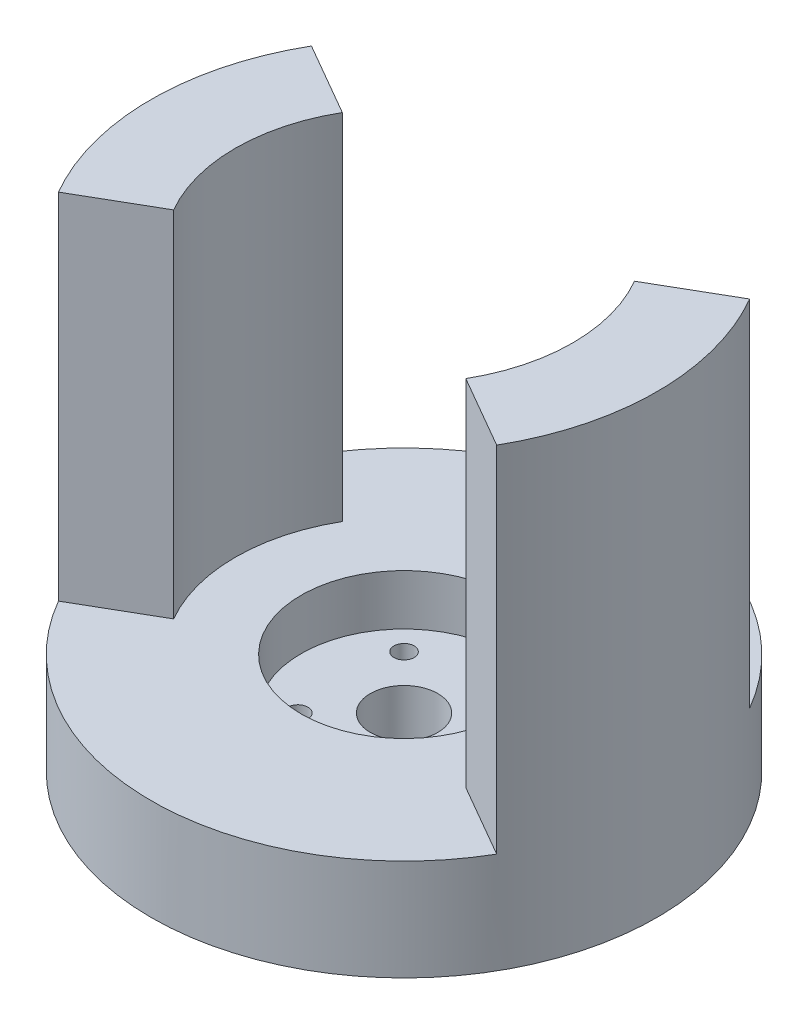
ISO-10303-21;
HEADER;
FILE_DESCRIPTION(('STEP AP214'),'2;1');
FILE_NAME('part.step','',(''),(''),'','','');
FILE_SCHEMA(('AUTOMOTIVE_DESIGN { 1 0 10303 214 1 1 1 1 }'));
ENDSEC;
DATA;
#1=APPLICATION_CONTEXT('core data for automotive mechanical design processes');
#2=APPLICATION_PROTOCOL_DEFINITION('international standard','automotive_design',2000,#1);
#3=PRODUCT_CONTEXT('',#1,'mechanical');
#4=PRODUCT('Part','Part','',(#3));
#5=PRODUCT_RELATED_PRODUCT_CATEGORY('part','',(#4));
#6=PRODUCT_DEFINITION_FORMATION('','',#4);
#7=PRODUCT_DEFINITION_CONTEXT('part definition',#1,'design');
#8=PRODUCT_DEFINITION('design','',#6,#7);
#9=PRODUCT_DEFINITION_SHAPE('','',#8);
#10=(LENGTH_UNIT() NAMED_UNIT(*) SI_UNIT(.MILLI.,.METRE.));
#11=(NAMED_UNIT(*) PLANE_ANGLE_UNIT() SI_UNIT($,.RADIAN.));
#12=(NAMED_UNIT(*) SI_UNIT($,.STERADIAN.) SOLID_ANGLE_UNIT());
#13=UNCERTAINTY_MEASURE_WITH_UNIT(LENGTH_MEASURE(1.E-05),#10,'distance_accuracy_value','');
#14=(GEOMETRIC_REPRESENTATION_CONTEXT(3) GLOBAL_UNCERTAINTY_ASSIGNED_CONTEXT((#13)) GLOBAL_UNIT_ASSIGNED_CONTEXT((#10,
#11,#12)) REPRESENTATION_CONTEXT('',''));
#15=CARTESIAN_POINT('',(0.,0.,0.));
#16=DIRECTION('',(0.,0.,1.));
#17=DIRECTION('',(1.,0.,0.));
#18=AXIS2_PLACEMENT_3D('',#15,#16,#17);
#19=CARTESIAN_POINT('',(0.,30.,0.));
#20=DIRECTION('',(0.,1.,0.));
#21=DIRECTION('',(0.,0.,1.));
#22=AXIS2_PLACEMENT_3D('',#19,#20,#21);
#23=PLANE('',#22);
#24=CARTESIAN_POINT('',(0.,30.,0.));
#25=DIRECTION('',(0.,1.,0.));
#26=DIRECTION('',(0.,0.,1.));
#27=AXIS2_PLACEMENT_3D('',#24,#25,#26);
#28=CIRCLE('',#27,30.5);
#29=CARTESIAN_POINT('',(0.,30.,30.5));
#30=VERTEX_POINT('',#29);
#31=EDGE_CURVE('E169',#30,#30,#28,.T.);
#32=ORIENTED_EDGE('',*,*,#31,.F.);
#33=EDGE_LOOP('',(#32));
#34=FACE_BOUND('',#33,.T.);
#35=CARTESIAN_POINT('',(0.,30.,0.));
#36=DIRECTION('',(0.,-1.,0.));
#37=DIRECTION('',(0.,0.,-1.));
#38=AXIS2_PLACEMENT_3D('',#35,#36,#37);
#39=CIRCLE('',#38,50.);
#40=CARTESIAN_POINT('',(43.301270189222,30.,-24.9999999999999));
#41=VERTEX_POINT('',#40);
#42=CARTESIAN_POINT('',(43.301270189222,30.,24.9999999999999));
#43=VERTEX_POINT('',#42);
#44=EDGE_CURVE('E283',#41,#43,#39,.T.);
#45=ORIENTED_EDGE('',*,*,#44,.F.);
#46=DIRECTION('',(-0.86602540378444,0.,0.499999999999998));
#47=VECTOR('',#46,1.);
#48=CARTESIAN_POINT('',(43.301270189222,30.,-24.9999999999999));
#49=LINE('',#48,#47);
#50=CARTESIAN_POINT('',(64.951905283833,30.,-37.4999999999999));
#51=VERTEX_POINT('',#50);
#52=EDGE_CURVE('E281',#51,#41,#49,.T.);
#53=ORIENTED_EDGE('',*,*,#52,.F.);
#54=CARTESIAN_POINT('',(0.,30.,0.));
#55=DIRECTION('',(0.,1.,0.));
#56=DIRECTION('',(0.,0.,1.));
#57=AXIS2_PLACEMENT_3D('',#54,#55,#56);
#58=CIRCLE('',#57,75.);
#59=CARTESIAN_POINT('',(-64.951905283833,30.,-37.4999999999998));
#60=VERTEX_POINT('',#59);
#61=EDGE_CURVE('E42',#51,#60,#58,.T.);
#62=ORIENTED_EDGE('',*,*,#61,.T.);
#63=DIRECTION('',(-0.86602540378444,0.,-0.499999999999998));
#64=VECTOR('',#63,1.);
#65=CARTESIAN_POINT('',(-43.301270189222,30.,-24.9999999999999));
#66=LINE('',#65,#64);
#67=CARTESIAN_POINT('',(-43.301270189222,30.,-24.9999999999999));
#68=VERTEX_POINT('',#67);
#69=EDGE_CURVE('E58',#68,#60,#66,.T.);
#70=ORIENTED_EDGE('',*,*,#69,.F.);
#71=CARTESIAN_POINT('',(0.,30.,0.));
#72=DIRECTION('',(0.,-1.,0.));
#73=DIRECTION('',(0.,0.,1.));
#74=AXIS2_PLACEMENT_3D('',#71,#72,#73);
#75=CIRCLE('',#74,50.);
#76=CARTESIAN_POINT('',(-43.301270189222,30.,24.9999999999999));
#77=VERTEX_POINT('',#76);
#78=EDGE_CURVE('E128',#77,#68,#75,.T.);
#79=ORIENTED_EDGE('',*,*,#78,.F.);
#80=DIRECTION('',(0.86602540378444,0.,-0.499999999999998));
#81=VECTOR('',#80,1.);
#82=CARTESIAN_POINT('',(-43.301270189222,30.,24.9999999999999));
#83=LINE('',#82,#81);
#84=CARTESIAN_POINT('',(-64.951905283833,30.,37.4999999999999));
#85=VERTEX_POINT('',#84);
#86=EDGE_CURVE('E125',#85,#77,#83,.T.);
#87=ORIENTED_EDGE('',*,*,#86,.F.);
#88=CARTESIAN_POINT('',(64.951905283833,30.,37.4999999999998));
#89=VERTEX_POINT('',#88);
#90=EDGE_CURVE('E11',#85,#89,#58,.T.);
#91=ORIENTED_EDGE('',*,*,#90,.T.);
#92=DIRECTION('',(0.86602540378444,0.,0.499999999999998));
#93=VECTOR('',#92,1.);
#94=CARTESIAN_POINT('',(43.301270189222,30.,24.9999999999999));
#95=LINE('',#94,#93);
#96=EDGE_CURVE('E119',#43,#89,#95,.T.);
#97=ORIENTED_EDGE('',*,*,#96,.F.);
#98=EDGE_LOOP('',(#45,#53,#62,#70,#79,#87,#91,#97));
#99=FACE_BOUND('',#98,.T.);
#100=ADVANCED_FACE('F33',(#34,#99),#23,.T.);
#101=CARTESIAN_POINT('',(0.,30.,0.));
#102=DIRECTION('',(0.,-1.,0.));
#103=DIRECTION('',(0.,0.,-1.));
#104=AXIS2_PLACEMENT_3D('',#101,#102,#103);
#105=CYLINDRICAL_SURFACE('',#104,75.);
#106=ORIENTED_EDGE('',*,*,#90,.F.);
#107=DIRECTION('',(0.,-1.,0.));
#108=VECTOR('',#107,1.);
#109=CARTESIAN_POINT('',(-64.951905283833,135.,37.4999999999999));
#110=LINE('',#109,#108);
#111=CARTESIAN_POINT('',(-64.951905283833,135.,37.4999999999999));
#112=VERTEX_POINT('',#111);
#113=EDGE_CURVE('E167',#112,#85,#110,.T.);
#114=ORIENTED_EDGE('',*,*,#113,.F.);
#115=CARTESIAN_POINT('',(0.,135.,0.));
#116=DIRECTION('',(0.,1.,0.));
#117=DIRECTION('',(0.,0.,1.));
#118=AXIS2_PLACEMENT_3D('',#115,#116,#117);
#119=CIRCLE('',#118,75.);
#120=CARTESIAN_POINT('',(-64.951905283833,135.,-37.4999999999998));
#121=VERTEX_POINT('',#120);
#122=EDGE_CURVE('E133',#121,#112,#119,.T.);
#123=ORIENTED_EDGE('',*,*,#122,.F.);
#124=DIRECTION('',(0.,-1.,0.));
#125=VECTOR('',#124,1.);
#126=CARTESIAN_POINT('',(-64.951905283833,135.,-37.4999999999998));
#127=LINE('',#126,#125);
#128=EDGE_CURVE('E142',#121,#60,#127,.T.);
#129=ORIENTED_EDGE('',*,*,#128,.T.);
#130=ORIENTED_EDGE('',*,*,#61,.F.);
#131=DIRECTION('',(0.,-1.,0.));
#132=VECTOR('',#131,1.);
#133=CARTESIAN_POINT('',(64.951905283833,135.,-37.4999999999999));
#134=LINE('',#133,#132);
#135=CARTESIAN_POINT('',(64.951905283833,135.,-37.4999999999999));
#136=VERTEX_POINT('',#135);
#137=EDGE_CURVE('E104',#136,#51,#134,.T.);
#138=ORIENTED_EDGE('',*,*,#137,.F.);
#139=CARTESIAN_POINT('',(0.,135.,0.));
#140=DIRECTION('',(0.,1.,0.));
#141=DIRECTION('',(0.,0.,-1.));
#142=AXIS2_PLACEMENT_3D('',#139,#140,#141);
#143=CIRCLE('',#142,75.);
#144=CARTESIAN_POINT('',(64.951905283833,135.,37.4999999999998));
#145=VERTEX_POINT('',#144);
#146=EDGE_CURVE('E111',#145,#136,#143,.T.);
#147=ORIENTED_EDGE('',*,*,#146,.F.);
#148=DIRECTION('',(0.,-1.,0.));
#149=VECTOR('',#148,1.);
#150=CARTESIAN_POINT('',(64.951905283833,135.,37.4999999999998));
#151=LINE('',#150,#149);
#152=EDGE_CURVE('E280',#145,#89,#151,.T.);
#153=ORIENTED_EDGE('',*,*,#152,.T.);
#154=EDGE_LOOP('',(#106,#114,#123,#129,#130,#138,#147,#153));
#155=FACE_BOUND('',#154,.T.);
#156=CARTESIAN_POINT('',(0.,0.,0.));
#157=DIRECTION('',(0.,1.,0.));
#158=DIRECTION('',(0.,0.,1.));
#159=AXIS2_PLACEMENT_3D('',#156,#157,#158);
#160=CIRCLE('',#159,75.);
#161=CARTESIAN_POINT('',(0.,0.,75.));
#162=VERTEX_POINT('',#161);
#163=EDGE_CURVE('E158',#162,#162,#160,.T.);
#164=ORIENTED_EDGE('',*,*,#163,.T.);
#165=EDGE_LOOP('',(#164));
#166=FACE_BOUND('',#165,.T.);
#167=ADVANCED_FACE('F35',(#155,#166),#105,.T.);
#168=CARTESIAN_POINT('',(0.,0.,0.));
#169=DIRECTION('',(0.,1.,0.));
#170=DIRECTION('',(0.,0.,1.));
#171=AXIS2_PLACEMENT_3D('',#168,#169,#170);
#172=PLANE('',#171);
#173=CARTESIAN_POINT('',(-15.7331258814007,0.,-15.7331258814007));
#174=DIRECTION('',(0.,-1.,0.));
#175=DIRECTION('',(0.,0.,-1.));
#176=AXIS2_PLACEMENT_3D('',#173,#174,#175);
#177=CIRCLE('',#176,3.);
#178=CARTESIAN_POINT('',(-15.7331258814007,0.,-18.7331258814007));
#179=VERTEX_POINT('',#178);
#180=EDGE_CURVE('E260',#179,#179,#177,.T.);
#181=ORIENTED_EDGE('',*,*,#180,.F.);
#182=EDGE_LOOP('',(#181));
#183=FACE_BOUND('',#182,.T.);
#184=CARTESIAN_POINT('',(15.7331258814007,0.,-15.7331258814007));
#185=DIRECTION('',(0.,-1.,0.));
#186=DIRECTION('',(0.,0.,-1.));
#187=AXIS2_PLACEMENT_3D('',#184,#185,#186);
#188=CIRCLE('',#187,3.);
#189=CARTESIAN_POINT('',(15.7331258814007,0.,-18.7331258814007));
#190=VERTEX_POINT('',#189);
#191=EDGE_CURVE('E262',#190,#190,#188,.T.);
#192=ORIENTED_EDGE('',*,*,#191,.F.);
#193=EDGE_LOOP('',(#192));
#194=FACE_BOUND('',#193,.T.);
#195=CARTESIAN_POINT('',(15.7331258814007,0.,15.7331258814007));
#196=DIRECTION('',(0.,-1.,0.));
#197=DIRECTION('',(0.,0.,-1.));
#198=AXIS2_PLACEMENT_3D('',#195,#196,#197);
#199=CIRCLE('',#198,3.);
#200=CARTESIAN_POINT('',(15.7331258814007,0.,12.7331258814007));
#201=VERTEX_POINT('',#200);
#202=EDGE_CURVE('E267',#201,#201,#199,.T.);
#203=ORIENTED_EDGE('',*,*,#202,.F.);
#204=EDGE_LOOP('',(#203));
#205=FACE_BOUND('',#204,.T.);
#206=CARTESIAN_POINT('',(-15.7331258814007,0.,15.7331258814007));
#207=DIRECTION('',(0.,-1.,0.));
#208=DIRECTION('',(0.,0.,-1.));
#209=AXIS2_PLACEMENT_3D('',#206,#207,#208);
#210=CIRCLE('',#209,3.);
#211=CARTESIAN_POINT('',(-15.7331258814007,0.,12.7331258814007));
#212=VERTEX_POINT('',#211);
#213=EDGE_CURVE('E271',#212,#212,#210,.T.);
#214=ORIENTED_EDGE('',*,*,#213,.F.);
#215=EDGE_LOOP('',(#214));
#216=FACE_BOUND('',#215,.T.);
#217=CARTESIAN_POINT('',(0.,0.,0.));
#218=DIRECTION('',(0.,-1.,0.));
#219=DIRECTION('',(0.,0.,-1.));
#220=AXIS2_PLACEMENT_3D('',#217,#218,#219);
#221=CIRCLE('',#220,10.);
#222=CARTESIAN_POINT('',(0.,0.,-10.));
#223=VERTEX_POINT('',#222);
#224=EDGE_CURVE('E275',#223,#223,#221,.T.);
#225=ORIENTED_EDGE('',*,*,#224,.F.);
#226=EDGE_LOOP('',(#225));
#227=FACE_BOUND('',#226,.T.);
#228=ORIENTED_EDGE('',*,*,#163,.F.);
#229=EDGE_LOOP('',(#228));
#230=FACE_BOUND('',#229,.T.);
#231=ADVANCED_FACE('F187',(#183,#194,#205,#216,#227,#230),#172,.F.);
#232=CARTESIAN_POINT('',(0.,15.,0.));
#233=DIRECTION('',(0.,1.,0.));
#234=DIRECTION('',(0.,0.,1.));
#235=AXIS2_PLACEMENT_3D('',#232,#233,#234);
#236=CYLINDRICAL_SURFACE('',#235,30.5);
#237=CARTESIAN_POINT('',(0.,15.,0.));
#238=DIRECTION('',(0.,1.,0.));
#239=DIRECTION('',(0.,0.,1.));
#240=AXIS2_PLACEMENT_3D('',#237,#238,#239);
#241=CIRCLE('',#240,30.5);
#242=CARTESIAN_POINT('',(0.,15.,30.5));
#243=VERTEX_POINT('',#242);
#244=EDGE_CURVE('E174',#243,#243,#241,.T.);
#245=ORIENTED_EDGE('',*,*,#244,.F.);
#246=EDGE_LOOP('',(#245));
#247=FACE_BOUND('',#246,.T.);
#248=ORIENTED_EDGE('',*,*,#31,.T.);
#249=EDGE_LOOP('',(#248));
#250=FACE_BOUND('',#249,.T.);
#251=ADVANCED_FACE('F189',(#247,#250),#236,.F.);
#252=CARTESIAN_POINT('',(0.,15.,0.));
#253=DIRECTION('',(0.,1.,0.));
#254=DIRECTION('',(0.,0.,1.));
#255=AXIS2_PLACEMENT_3D('',#252,#253,#254);
#256=PLANE('',#255);
#257=CARTESIAN_POINT('',(-15.7331258814007,15.,-15.7331258814007));
#258=DIRECTION('',(0.,1.,0.));
#259=DIRECTION('',(0.,0.,1.));
#260=AXIS2_PLACEMENT_3D('',#257,#258,#259);
#261=CIRCLE('',#260,3.);
#262=CARTESIAN_POINT('',(-15.7331258814007,15.,-12.7331258814007));
#263=VERTEX_POINT('',#262);
#264=EDGE_CURVE('E37',#263,#263,#261,.T.);
#265=ORIENTED_EDGE('',*,*,#264,.F.);
#266=EDGE_LOOP('',(#265));
#267=FACE_BOUND('',#266,.T.);
#268=CARTESIAN_POINT('',(15.7331258814007,15.,-15.7331258814007));
#269=DIRECTION('',(0.,1.,0.));
#270=DIRECTION('',(0.,0.,1.));
#271=AXIS2_PLACEMENT_3D('',#268,#269,#270);
#272=CIRCLE('',#271,3.);
#273=CARTESIAN_POINT('',(15.7331258814007,15.,-12.7331258814007));
#274=VERTEX_POINT('',#273);
#275=EDGE_CURVE('E266',#274,#274,#272,.T.);
#276=ORIENTED_EDGE('',*,*,#275,.F.);
#277=EDGE_LOOP('',(#276));
#278=FACE_BOUND('',#277,.T.);
#279=CARTESIAN_POINT('',(15.7331258814007,15.,15.7331258814007));
#280=DIRECTION('',(0.,1.,0.));
#281=DIRECTION('',(0.,0.,1.));
#282=AXIS2_PLACEMENT_3D('',#279,#280,#281);
#283=CIRCLE('',#282,3.);
#284=CARTESIAN_POINT('',(15.7331258814007,15.,18.7331258814007));
#285=VERTEX_POINT('',#284);
#286=EDGE_CURVE('E270',#285,#285,#283,.T.);
#287=ORIENTED_EDGE('',*,*,#286,.F.);
#288=EDGE_LOOP('',(#287));
#289=FACE_BOUND('',#288,.T.);
#290=CARTESIAN_POINT('',(-15.7331258814007,15.,15.7331258814007));
#291=DIRECTION('',(0.,1.,0.));
#292=DIRECTION('',(0.,0.,1.));
#293=AXIS2_PLACEMENT_3D('',#290,#291,#292);
#294=CIRCLE('',#293,3.);
#295=CARTESIAN_POINT('',(-15.7331258814007,15.,18.7331258814007));
#296=VERTEX_POINT('',#295);
#297=EDGE_CURVE('E274',#296,#296,#294,.T.);
#298=ORIENTED_EDGE('',*,*,#297,.F.);
#299=EDGE_LOOP('',(#298));
#300=FACE_BOUND('',#299,.T.);
#301=CARTESIAN_POINT('',(0.,15.,0.));
#302=DIRECTION('',(0.,1.,0.));
#303=DIRECTION('',(0.,0.,1.));
#304=AXIS2_PLACEMENT_3D('',#301,#302,#303);
#305=CIRCLE('',#304,10.);
#306=CARTESIAN_POINT('',(0.,15.,10.));
#307=VERTEX_POINT('',#306);
#308=EDGE_CURVE('E159',#307,#307,#305,.T.);
#309=ORIENTED_EDGE('',*,*,#308,.F.);
#310=EDGE_LOOP('',(#309));
#311=FACE_BOUND('',#310,.T.);
#312=ORIENTED_EDGE('',*,*,#244,.T.);
#313=EDGE_LOOP('',(#312));
#314=FACE_BOUND('',#313,.T.);
#315=ADVANCED_FACE('F195',(#267,#278,#289,#300,#311,#314),#256,.T.);
#316=CARTESIAN_POINT('',(-43.301270189222,135.,24.9999999999999));
#317=DIRECTION('',(-0.499999999999998,0.,-0.86602540378444));
#318=DIRECTION('',(-0.86602540378444,0.,0.499999999999998));
#319=AXIS2_PLACEMENT_3D('',#316,#317,#318);
#320=PLANE('',#319);
#321=ORIENTED_EDGE('',*,*,#86,.T.);
#322=DIRECTION('',(0.,-1.,0.));
#323=VECTOR('',#322,1.);
#324=CARTESIAN_POINT('',(-43.301270189222,135.,24.9999999999999));
#325=LINE('',#324,#323);
#326=CARTESIAN_POINT('',(-43.301270189222,135.,24.9999999999999));
#327=VERTEX_POINT('',#326);
#328=EDGE_CURVE('E170',#327,#77,#325,.T.);
#329=ORIENTED_EDGE('',*,*,#328,.F.);
#330=DIRECTION('',(0.86602540378444,0.,-0.499999999999998));
#331=VECTOR('',#330,1.);
#332=CARTESIAN_POINT('',(-43.301270189222,135.,24.9999999999999));
#333=LINE('',#332,#331);
#334=EDGE_CURVE('E136',#112,#327,#333,.T.);
#335=ORIENTED_EDGE('',*,*,#334,.F.);
#336=ORIENTED_EDGE('',*,*,#113,.T.);
#337=EDGE_LOOP('',(#321,#329,#335,#336));
#338=FACE_BOUND('',#337,.T.);
#339=ADVANCED_FACE('F209',(#338),#320,.F.);
#340=CARTESIAN_POINT('',(0.,135.,0.));
#341=DIRECTION('',(0.,-1.,0.));
#342=DIRECTION('',(0.,0.,-1.));
#343=AXIS2_PLACEMENT_3D('',#340,#341,#342);
#344=CYLINDRICAL_SURFACE('',#343,50.);
#345=ORIENTED_EDGE('',*,*,#78,.T.);
#346=DIRECTION('',(0.,-1.,0.));
#347=VECTOR('',#346,1.);
#348=CARTESIAN_POINT('',(-43.301270189222,135.,-24.9999999999999));
#349=LINE('',#348,#347);
#350=CARTESIAN_POINT('',(-43.301270189222,135.,-24.9999999999999));
#351=VERTEX_POINT('',#350);
#352=EDGE_CURVE('E146',#351,#68,#349,.T.);
#353=ORIENTED_EDGE('',*,*,#352,.F.);
#354=CARTESIAN_POINT('',(0.,135.,0.));
#355=DIRECTION('',(0.,-1.,0.));
#356=DIRECTION('',(0.,0.,1.));
#357=AXIS2_PLACEMENT_3D('',#354,#355,#356);
#358=CIRCLE('',#357,50.);
#359=EDGE_CURVE('E138',#327,#351,#358,.T.);
#360=ORIENTED_EDGE('',*,*,#359,.F.);
#361=ORIENTED_EDGE('',*,*,#328,.T.);
#362=EDGE_LOOP('',(#345,#353,#360,#361));
#363=FACE_BOUND('',#362,.T.);
#364=ADVANCED_FACE('F213',(#363),#344,.F.);
#365=CARTESIAN_POINT('',(-43.301270189222,135.,-24.9999999999999));
#366=DIRECTION('',(-0.499999999999998,0.,0.86602540378444));
#367=DIRECTION('',(0.86602540378444,0.,0.499999999999998));
#368=AXIS2_PLACEMENT_3D('',#365,#366,#367);
#369=PLANE('',#368);
#370=ORIENTED_EDGE('',*,*,#69,.T.);
#371=ORIENTED_EDGE('',*,*,#128,.F.);
#372=DIRECTION('',(-0.86602540378444,0.,-0.499999999999998));
#373=VECTOR('',#372,1.);
#374=CARTESIAN_POINT('',(-43.301270189222,135.,-24.9999999999999));
#375=LINE('',#374,#373);
#376=EDGE_CURVE('E140',#351,#121,#375,.T.);
#377=ORIENTED_EDGE('',*,*,#376,.F.);
#378=ORIENTED_EDGE('',*,*,#352,.T.);
#379=EDGE_LOOP('',(#370,#371,#377,#378));
#380=FACE_BOUND('',#379,.T.);
#381=ADVANCED_FACE('F216',(#380),#369,.F.);
#382=CARTESIAN_POINT('',(0.,135.,0.));
#383=DIRECTION('',(0.,1.,0.));
#384=DIRECTION('',(0.,0.,1.));
#385=AXIS2_PLACEMENT_3D('',#382,#383,#384);
#386=PLANE('',#385);
#387=ORIENTED_EDGE('',*,*,#122,.T.);
#388=ORIENTED_EDGE('',*,*,#334,.T.);
#389=ORIENTED_EDGE('',*,*,#359,.T.);
#390=ORIENTED_EDGE('',*,*,#376,.T.);
#391=EDGE_LOOP('',(#387,#388,#389,#390));
#392=FACE_BOUND('',#391,.T.);
#393=ADVANCED_FACE('F219',(#392),#386,.T.);
#394=CARTESIAN_POINT('',(43.301270189222,135.,-24.9999999999999));
#395=DIRECTION('',(0.499999999999998,0.,0.86602540378444));
#396=DIRECTION('',(0.86602540378444,0.,-0.499999999999998));
#397=AXIS2_PLACEMENT_3D('',#394,#395,#396);
#398=PLANE('',#397);
#399=ORIENTED_EDGE('',*,*,#52,.T.);
#400=DIRECTION('',(0.,-1.,0.));
#401=VECTOR('',#400,1.);
#402=CARTESIAN_POINT('',(43.301270189222,135.,-24.9999999999999));
#403=LINE('',#402,#401);
#404=CARTESIAN_POINT('',(43.301270189222,135.,-24.9999999999999));
#405=VERTEX_POINT('',#404);
#406=EDGE_CURVE('E107',#405,#41,#403,.T.);
#407=ORIENTED_EDGE('',*,*,#406,.F.);
#408=DIRECTION('',(-0.86602540378444,0.,0.499999999999998));
#409=VECTOR('',#408,1.);
#410=CARTESIAN_POINT('',(43.301270189222,135.,-24.9999999999999));
#411=LINE('',#410,#409);
#412=EDGE_CURVE('E100',#136,#405,#411,.T.);
#413=ORIENTED_EDGE('',*,*,#412,.F.);
#414=ORIENTED_EDGE('',*,*,#137,.T.);
#415=EDGE_LOOP('',(#399,#407,#413,#414));
#416=FACE_BOUND('',#415,.T.);
#417=ADVANCED_FACE('F102',(#416),#398,.F.);
#418=CARTESIAN_POINT('',(0.,135.,0.));
#419=DIRECTION('',(0.,-1.,0.));
#420=DIRECTION('',(0.,0.,-1.));
#421=AXIS2_PLACEMENT_3D('',#418,#419,#420);
#422=CYLINDRICAL_SURFACE('',#421,50.);
#423=ORIENTED_EDGE('',*,*,#44,.T.);
#424=DIRECTION('',(0.,-1.,0.));
#425=VECTOR('',#424,1.);
#426=CARTESIAN_POINT('',(43.301270189222,135.,24.9999999999999));
#427=LINE('',#426,#425);
#428=CARTESIAN_POINT('',(43.301270189222,135.,24.9999999999999));
#429=VERTEX_POINT('',#428);
#430=EDGE_CURVE('E50',#429,#43,#427,.T.);
#431=ORIENTED_EDGE('',*,*,#430,.F.);
#432=CARTESIAN_POINT('',(0.,135.,0.));
#433=DIRECTION('',(0.,-1.,0.));
#434=DIRECTION('',(0.,0.,-1.));
#435=AXIS2_PLACEMENT_3D('',#432,#433,#434);
#436=CIRCLE('',#435,50.);
#437=EDGE_CURVE('E110',#405,#429,#436,.T.);
#438=ORIENTED_EDGE('',*,*,#437,.F.);
#439=ORIENTED_EDGE('',*,*,#406,.T.);
#440=EDGE_LOOP('',(#423,#431,#438,#439));
#441=FACE_BOUND('',#440,.T.);
#442=ADVANCED_FACE('F226',(#441),#422,.F.);
#443=CARTESIAN_POINT('',(43.301270189222,135.,24.9999999999999));
#444=DIRECTION('',(0.499999999999998,0.,-0.86602540378444));
#445=DIRECTION('',(-0.86602540378444,0.,-0.499999999999998));
#446=AXIS2_PLACEMENT_3D('',#443,#444,#445);
#447=PLANE('',#446);
#448=ORIENTED_EDGE('',*,*,#96,.T.);
#449=ORIENTED_EDGE('',*,*,#152,.F.);
#450=DIRECTION('',(0.86602540378444,0.,0.499999999999998));
#451=VECTOR('',#450,1.);
#452=CARTESIAN_POINT('',(43.301270189222,135.,24.9999999999999));
#453=LINE('',#452,#451);
#454=EDGE_CURVE('E115',#429,#145,#453,.T.);
#455=ORIENTED_EDGE('',*,*,#454,.F.);
#456=ORIENTED_EDGE('',*,*,#430,.T.);
#457=EDGE_LOOP('',(#448,#449,#455,#456));
#458=FACE_BOUND('',#457,.T.);
#459=ADVANCED_FACE('F229',(#458),#447,.F.);
#460=CARTESIAN_POINT('',(0.,135.,0.));
#461=DIRECTION('',(0.,-1.,0.));
#462=DIRECTION('',(0.,0.,-1.));
#463=AXIS2_PLACEMENT_3D('',#460,#461,#462);
#464=PLANE('',#463);
#465=ORIENTED_EDGE('',*,*,#146,.T.);
#466=ORIENTED_EDGE('',*,*,#412,.T.);
#467=ORIENTED_EDGE('',*,*,#437,.T.);
#468=ORIENTED_EDGE('',*,*,#454,.T.);
#469=EDGE_LOOP('',(#465,#466,#467,#468));
#470=FACE_BOUND('',#469,.T.);
#471=ADVANCED_FACE('F114',(#470),#464,.F.);
#472=CARTESIAN_POINT('',(0.,105.,0.));
#473=DIRECTION('',(0.,-1.,0.));
#474=DIRECTION('',(0.,0.,-1.));
#475=AXIS2_PLACEMENT_3D('',#472,#473,#474);
#476=CYLINDRICAL_SURFACE('',#475,10.);
#477=ORIENTED_EDGE('',*,*,#308,.T.);
#478=EDGE_LOOP('',(#477));
#479=FACE_BOUND('',#478,.T.);
#480=ORIENTED_EDGE('',*,*,#224,.T.);
#481=EDGE_LOOP('',(#480));
#482=FACE_BOUND('',#481,.T.);
#483=ADVANCED_FACE('F235',(#479,#482),#476,.F.);
#484=CARTESIAN_POINT('',(-15.7331258814007,105.,15.7331258814007));
#485=DIRECTION('',(0.,-1.,0.));
#486=DIRECTION('',(0.,0.,-1.));
#487=AXIS2_PLACEMENT_3D('',#484,#485,#486);
#488=CYLINDRICAL_SURFACE('',#487,3.);
#489=ORIENTED_EDGE('',*,*,#297,.T.);
#490=EDGE_LOOP('',(#489));
#491=FACE_BOUND('',#490,.T.);
#492=ORIENTED_EDGE('',*,*,#213,.T.);
#493=EDGE_LOOP('',(#492));
#494=FACE_BOUND('',#493,.T.);
#495=ADVANCED_FACE('F238',(#491,#494),#488,.F.);
#496=CARTESIAN_POINT('',(15.7331258814007,105.,15.7331258814007));
#497=DIRECTION('',(0.,-1.,0.));
#498=DIRECTION('',(0.,0.,-1.));
#499=AXIS2_PLACEMENT_3D('',#496,#497,#498);
#500=CYLINDRICAL_SURFACE('',#499,3.);
#501=ORIENTED_EDGE('',*,*,#286,.T.);
#502=EDGE_LOOP('',(#501));
#503=FACE_BOUND('',#502,.T.);
#504=ORIENTED_EDGE('',*,*,#202,.T.);
#505=EDGE_LOOP('',(#504));
#506=FACE_BOUND('',#505,.T.);
#507=ADVANCED_FACE('F242',(#503,#506),#500,.F.);
#508=CARTESIAN_POINT('',(15.7331258814007,105.,-15.7331258814007));
#509=DIRECTION('',(0.,-1.,0.));
#510=DIRECTION('',(0.,0.,-1.));
#511=AXIS2_PLACEMENT_3D('',#508,#509,#510);
#512=CYLINDRICAL_SURFACE('',#511,3.);
#513=ORIENTED_EDGE('',*,*,#275,.T.);
#514=EDGE_LOOP('',(#513));
#515=FACE_BOUND('',#514,.T.);
#516=ORIENTED_EDGE('',*,*,#191,.T.);
#517=EDGE_LOOP('',(#516));
#518=FACE_BOUND('',#517,.T.);
#519=ADVANCED_FACE('F246',(#515,#518),#512,.F.);
#520=CARTESIAN_POINT('',(-15.7331258814007,105.,-15.7331258814007));
#521=DIRECTION('',(0.,-1.,0.));
#522=DIRECTION('',(0.,0.,-1.));
#523=AXIS2_PLACEMENT_3D('',#520,#521,#522);
#524=CYLINDRICAL_SURFACE('',#523,3.);
#525=ORIENTED_EDGE('',*,*,#264,.T.);
#526=EDGE_LOOP('',(#525));
#527=FACE_BOUND('',#526,.T.);
#528=ORIENTED_EDGE('',*,*,#180,.T.);
#529=EDGE_LOOP('',(#528));
#530=FACE_BOUND('',#529,.T.);
#531=ADVANCED_FACE('F250',(#527,#530),#524,.F.);
#532=CLOSED_SHELL('',(#100,#167,#231,#251,#315,#339,#364,#381,#393,#417,#442,#459,#471,#483,
#495,#507,#519,#531));
#533=MANIFOLD_SOLID_BREP('B2',#532);
#534=ADVANCED_BREP_SHAPE_REPRESENTATION('',(#18,#533),#14);
#535=SHAPE_DEFINITION_REPRESENTATION(#9,#534);
ENDSEC;
END-ISO-10303-21;
